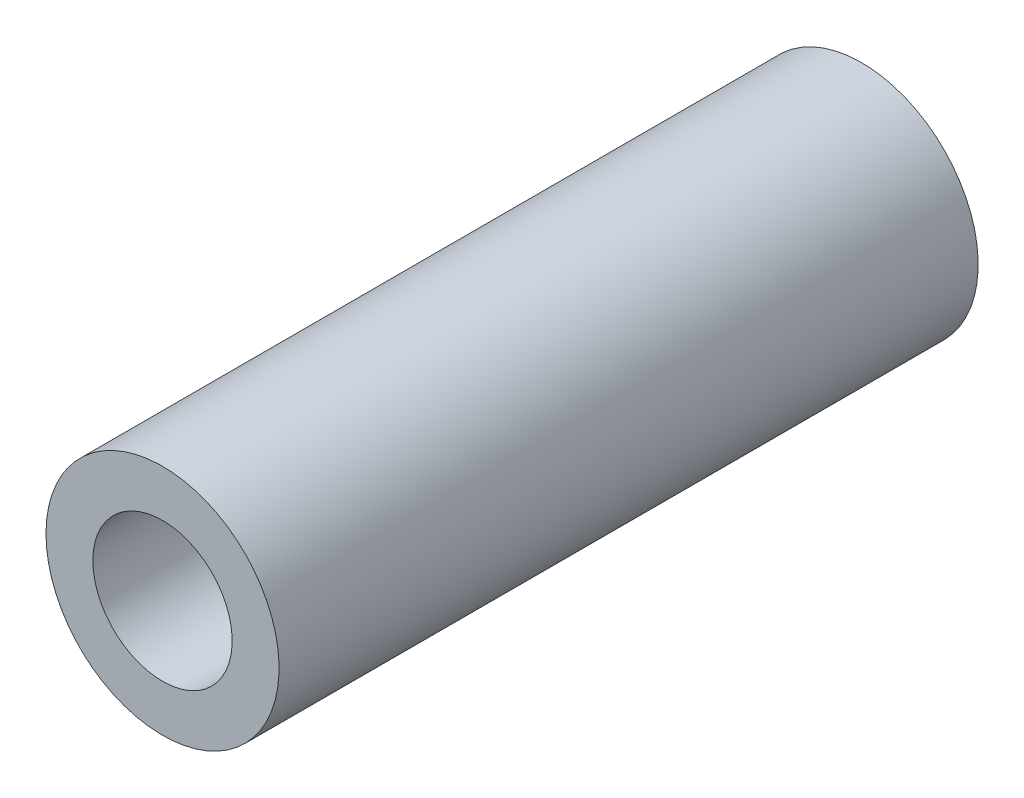
ISO-10303-21;
HEADER;
FILE_DESCRIPTION(('STEP AP214'),'2;1');
FILE_NAME('part.step','',(''),(''),'','','');
FILE_SCHEMA(('AUTOMOTIVE_DESIGN { 1 0 10303 214 1 1 1 1 }'));
ENDSEC;
DATA;
#1=APPLICATION_CONTEXT('core data for automotive mechanical design processes');
#2=APPLICATION_PROTOCOL_DEFINITION('international standard','automotive_design',2000,#1);
#3=PRODUCT_CONTEXT('',#1,'mechanical');
#4=PRODUCT('Part','Part','',(#3));
#5=PRODUCT_RELATED_PRODUCT_CATEGORY('part','',(#4));
#6=PRODUCT_DEFINITION_FORMATION('','',#4);
#7=PRODUCT_DEFINITION_CONTEXT('part definition',#1,'design');
#8=PRODUCT_DEFINITION('design','',#6,#7);
#9=PRODUCT_DEFINITION_SHAPE('','',#8);
#10=(LENGTH_UNIT() NAMED_UNIT(*) SI_UNIT(.MILLI.,.METRE.));
#11=(NAMED_UNIT(*) PLANE_ANGLE_UNIT() SI_UNIT($,.RADIAN.));
#12=(NAMED_UNIT(*) SI_UNIT($,.STERADIAN.) SOLID_ANGLE_UNIT());
#13=UNCERTAINTY_MEASURE_WITH_UNIT(LENGTH_MEASURE(1.E-05),#10,'distance_accuracy_value','');
#14=(GEOMETRIC_REPRESENTATION_CONTEXT(3) GLOBAL_UNCERTAINTY_ASSIGNED_CONTEXT((#13)) GLOBAL_UNIT_ASSIGNED_CONTEXT((#10,
#11,#12)) REPRESENTATION_CONTEXT('',''));
#15=CARTESIAN_POINT('',(0.,0.,0.));
#16=DIRECTION('',(0.,0.,1.));
#17=DIRECTION('',(1.,0.,0.));
#18=AXIS2_PLACEMENT_3D('',#15,#16,#17);
#19=CARTESIAN_POINT('',(0.,0.,19.05));
#20=DIRECTION('',(0.,0.,1.));
#21=DIRECTION('',(1.,0.,0.));
#22=AXIS2_PLACEMENT_3D('',#19,#20,#21);
#23=PLANE('',#22);
#24=CARTESIAN_POINT('',(0.,0.,19.05));
#25=DIRECTION('',(0.,0.,1.));
#26=DIRECTION('',(1.,0.,0.));
#27=AXIS2_PLACEMENT_3D('',#24,#25,#26);
#28=CIRCLE('',#27,3.175);
#29=CARTESIAN_POINT('',(-3.175,0.,19.05));
#30=VERTEX_POINT('',#29);
#31=EDGE_CURVE('E10',#30,#30,#28,.T.);
#32=ORIENTED_EDGE('',*,*,#31,.T.);
#33=EDGE_LOOP('',(#32));
#34=FACE_BOUND('',#33,.T.);
#35=CARTESIAN_POINT('',(0.,0.,19.05));
#36=DIRECTION('',(0.,0.,1.));
#37=DIRECTION('',(1.,0.,0.));
#38=AXIS2_PLACEMENT_3D('',#35,#36,#37);
#39=CIRCLE('',#38,1.89865);
#40=CARTESIAN_POINT('',(-1.89865,0.,19.05));
#41=VERTEX_POINT('',#40);
#42=EDGE_CURVE('E50',#41,#41,#39,.T.);
#43=ORIENTED_EDGE('',*,*,#42,.F.);
#44=EDGE_LOOP('',(#43));
#45=FACE_BOUND('',#44,.T.);
#46=ADVANCED_FACE('F37',(#34,#45),#23,.T.);
#47=CARTESIAN_POINT('',(0.,0.,0.));
#48=DIRECTION('',(0.,0.,1.));
#49=DIRECTION('',(1.,0.,0.));
#50=AXIS2_PLACEMENT_3D('',#47,#48,#49);
#51=PLANE('',#50);
#52=CARTESIAN_POINT('',(0.,0.,0.));
#53=DIRECTION('',(0.,0.,1.));
#54=DIRECTION('',(1.,0.,0.));
#55=AXIS2_PLACEMENT_3D('',#52,#53,#54);
#56=CIRCLE('',#55,3.175);
#57=CARTESIAN_POINT('',(-3.175,0.,0.));
#58=VERTEX_POINT('',#57);
#59=EDGE_CURVE('E41',#58,#58,#56,.T.);
#60=ORIENTED_EDGE('',*,*,#59,.F.);
#61=EDGE_LOOP('',(#60));
#62=FACE_BOUND('',#61,.T.);
#63=CARTESIAN_POINT('',(0.,0.,0.));
#64=DIRECTION('',(0.,0.,1.));
#65=DIRECTION('',(1.,0.,0.));
#66=AXIS2_PLACEMENT_3D('',#63,#64,#65);
#67=CIRCLE('',#66,1.89865);
#68=CARTESIAN_POINT('',(-1.89865,0.,0.));
#69=VERTEX_POINT('',#68);
#70=EDGE_CURVE('E52',#69,#69,#67,.T.);
#71=ORIENTED_EDGE('',*,*,#70,.T.);
#72=EDGE_LOOP('',(#71));
#73=FACE_BOUND('',#72,.T.);
#74=ADVANCED_FACE('F64',(#62,#73),#51,.F.);
#75=CARTESIAN_POINT('',(0.,0.,19.05));
#76=DIRECTION('',(0.,0.,-1.));
#77=DIRECTION('',(-1.,0.,0.));
#78=AXIS2_PLACEMENT_3D('',#75,#76,#77);
#79=CYLINDRICAL_SURFACE('',#78,3.175);
#80=CARTESIAN_POINT('',(-3.175,0.,19.05));
#81=CARTESIAN_POINT('',(-3.175,0.,18.8515625));
#82=CARTESIAN_POINT('',(-3.175,0.,18.653125));
#83=CARTESIAN_POINT('',(-3.175,0.,18.25625));
#84=CARTESIAN_POINT('',(-3.175,0.,18.0578125));
#85=CARTESIAN_POINT('',(-3.175,0.,17.6609375));
#86=CARTESIAN_POINT('',(-3.175,0.,17.4625));
#87=CARTESIAN_POINT('',(-3.175,0.,17.065625));
#88=CARTESIAN_POINT('',(-3.175,0.,16.8671875));
#89=CARTESIAN_POINT('',(-3.175,0.,16.4703125));
#90=CARTESIAN_POINT('',(-3.175,0.,16.271875));
#91=CARTESIAN_POINT('',(-3.175,0.,15.875));
#92=CARTESIAN_POINT('',(-3.175,0.,15.6765625));
#93=CARTESIAN_POINT('',(-3.175,0.,15.2796875));
#94=CARTESIAN_POINT('',(-3.175,0.,15.08125));
#95=CARTESIAN_POINT('',(-3.175,0.,14.684375));
#96=CARTESIAN_POINT('',(-3.175,0.,14.4859375));
#97=CARTESIAN_POINT('',(-3.175,0.,14.0890625));
#98=CARTESIAN_POINT('',(-3.175,0.,13.890625));
#99=CARTESIAN_POINT('',(-3.175,0.,13.49375));
#100=CARTESIAN_POINT('',(-3.175,0.,13.2953125));
#101=CARTESIAN_POINT('',(-3.175,0.,12.8984375));
#102=CARTESIAN_POINT('',(-3.175,0.,12.7));
#103=CARTESIAN_POINT('',(-3.175,0.,12.303125));
#104=CARTESIAN_POINT('',(-3.175,0.,12.1046875));
#105=CARTESIAN_POINT('',(-3.175,0.,11.7078125));
#106=CARTESIAN_POINT('',(-3.175,0.,11.509375));
#107=CARTESIAN_POINT('',(-3.175,0.,11.1125));
#108=CARTESIAN_POINT('',(-3.175,0.,10.9140625));
#109=CARTESIAN_POINT('',(-3.175,0.,10.5171875));
#110=CARTESIAN_POINT('',(-3.175,0.,10.31875));
#111=CARTESIAN_POINT('',(-3.175,0.,9.921875));
#112=CARTESIAN_POINT('',(-3.175,0.,9.7234375));
#113=CARTESIAN_POINT('',(-3.175,0.,9.3265625));
#114=CARTESIAN_POINT('',(-3.175,0.,9.128125));
#115=CARTESIAN_POINT('',(-3.175,0.,8.73125));
#116=CARTESIAN_POINT('',(-3.175,0.,8.5328125));
#117=CARTESIAN_POINT('',(-3.175,0.,8.1359375));
#118=CARTESIAN_POINT('',(-3.175,0.,7.9375));
#119=CARTESIAN_POINT('',(-3.175,0.,7.540625));
#120=CARTESIAN_POINT('',(-3.175,0.,7.3421875));
#121=CARTESIAN_POINT('',(-3.175,0.,6.9453125));
#122=CARTESIAN_POINT('',(-3.175,0.,6.746875));
#123=CARTESIAN_POINT('',(-3.175,0.,6.35));
#124=CARTESIAN_POINT('',(-3.175,0.,6.1515625));
#125=CARTESIAN_POINT('',(-3.175,0.,5.7546875));
#126=CARTESIAN_POINT('',(-3.175,0.,5.55625));
#127=CARTESIAN_POINT('',(-3.175,0.,5.159375));
#128=CARTESIAN_POINT('',(-3.175,0.,4.9609375));
#129=CARTESIAN_POINT('',(-3.175,0.,4.5640625));
#130=CARTESIAN_POINT('',(-3.175,0.,4.365625));
#131=CARTESIAN_POINT('',(-3.175,0.,3.96875));
#132=CARTESIAN_POINT('',(-3.175,0.,3.7703125));
#133=CARTESIAN_POINT('',(-3.175,0.,3.3734375));
#134=CARTESIAN_POINT('',(-3.175,0.,3.175));
#135=CARTESIAN_POINT('',(-3.175,0.,2.778125));
#136=CARTESIAN_POINT('',(-3.175,0.,2.5796875));
#137=CARTESIAN_POINT('',(-3.175,0.,2.1828125));
#138=CARTESIAN_POINT('',(-3.175,0.,1.984375));
#139=CARTESIAN_POINT('',(-3.175,0.,1.5875));
#140=CARTESIAN_POINT('',(-3.175,0.,1.3890625));
#141=CARTESIAN_POINT('',(-3.175,0.,0.992187500000001));
#142=CARTESIAN_POINT('',(-3.175,0.,0.793750000000001));
#143=CARTESIAN_POINT('',(-3.175,0.,0.396875));
#144=CARTESIAN_POINT('',(-3.175,0.,0.1984375));
#145=CARTESIAN_POINT('',(-3.175,0.,0.));
#146=B_SPLINE_CURVE_WITH_KNOTS('',3,(#80,#81,#82,#83,#84,#85,#86,#87,#88,#89,#90,#91,#92,#93,
#94,#95,#96,#97,#98,#99,#100,#101,#102,#103,#104,#105,#106,#107,#108,#109,#110,#111,#112,#113,
#114,#115,#116,#117,#118,#119,#120,#121,#122,#123,#124,#125,#126,#127,#128,#129,#130,#131,#132,
#133,#134,#135,#136,#137,#138,#139,#140,#141,#142,#143,#144,#145),.UNSPECIFIED.,.F.,.F.,(4,2,2,
2,2,2,2,2,2,2,2,2,2,2,2,2,2,2,2,2,2,2,2,2,2,2,2,2,2,2,2,2,4),(0.,0.595312499999997,1.190625,
1.7859375,2.38125,2.9765625,3.571875,4.1671875,4.7625,5.3578125,5.953125,6.5484375,7.14375,
7.7390625,8.334375,8.9296875,9.525,10.1203125,10.715625,11.3109375,11.90625,12.5015625,
13.096875,13.6921875,14.2875,14.8828125,15.478125,16.0734375,16.66875,17.2640625,17.859375,
18.4546875,19.05),.UNSPECIFIED.);
#147=EDGE_CURVE('BSEAM39',#30,#58,#146,.T.);
#148=ORIENTED_EDGE('',*,*,#31,.F.);
#149=ORIENTED_EDGE('',*,*,#59,.T.);
#150=ORIENTED_EDGE('',*,*,#147,.T.);
#151=ORIENTED_EDGE('',*,*,#147,.F.);
#152=EDGE_LOOP('',(#148,#150,#149,#151));
#153=FACE_BOUND('',#152,.T.);
#154=ADVANCED_FACE('F39',(#153),#79,.T.);
#155=CARTESIAN_POINT('',(0.,0.,19.05));
#156=DIRECTION('',(0.,0.,-1.));
#157=DIRECTION('',(-1.,0.,0.));
#158=AXIS2_PLACEMENT_3D('',#155,#156,#157);
#159=CYLINDRICAL_SURFACE('',#158,1.89865);
#160=CARTESIAN_POINT('',(-1.89865,0.,19.05));
#161=CARTESIAN_POINT('',(-1.89865,0.,18.8515625));
#162=CARTESIAN_POINT('',(-1.89865,0.,18.653125));
#163=CARTESIAN_POINT('',(-1.89865,0.,18.25625));
#164=CARTESIAN_POINT('',(-1.89865,0.,18.0578125));
#165=CARTESIAN_POINT('',(-1.89865,0.,17.6609375));
#166=CARTESIAN_POINT('',(-1.89865,0.,17.4625));
#167=CARTESIAN_POINT('',(-1.89865,0.,17.065625));
#168=CARTESIAN_POINT('',(-1.89865,0.,16.8671875));
#169=CARTESIAN_POINT('',(-1.89865,0.,16.4703125));
#170=CARTESIAN_POINT('',(-1.89865,0.,16.271875));
#171=CARTESIAN_POINT('',(-1.89865,0.,15.875));
#172=CARTESIAN_POINT('',(-1.89865,0.,15.6765625));
#173=CARTESIAN_POINT('',(-1.89865,0.,15.2796875));
#174=CARTESIAN_POINT('',(-1.89865,0.,15.08125));
#175=CARTESIAN_POINT('',(-1.89865,0.,14.684375));
#176=CARTESIAN_POINT('',(-1.89865,0.,14.4859375));
#177=CARTESIAN_POINT('',(-1.89865,0.,14.0890625));
#178=CARTESIAN_POINT('',(-1.89865,0.,13.890625));
#179=CARTESIAN_POINT('',(-1.89865,0.,13.49375));
#180=CARTESIAN_POINT('',(-1.89865,0.,13.2953125));
#181=CARTESIAN_POINT('',(-1.89865,0.,12.8984375));
#182=CARTESIAN_POINT('',(-1.89865,0.,12.7));
#183=CARTESIAN_POINT('',(-1.89865,0.,12.303125));
#184=CARTESIAN_POINT('',(-1.89865,0.,12.1046875));
#185=CARTESIAN_POINT('',(-1.89865,0.,11.7078125));
#186=CARTESIAN_POINT('',(-1.89865,0.,11.509375));
#187=CARTESIAN_POINT('',(-1.89865,0.,11.1125));
#188=CARTESIAN_POINT('',(-1.89865,0.,10.9140625));
#189=CARTESIAN_POINT('',(-1.89865,0.,10.5171875));
#190=CARTESIAN_POINT('',(-1.89865,0.,10.31875));
#191=CARTESIAN_POINT('',(-1.89865,0.,9.921875));
#192=CARTESIAN_POINT('',(-1.89865,0.,9.7234375));
#193=CARTESIAN_POINT('',(-1.89865,0.,9.3265625));
#194=CARTESIAN_POINT('',(-1.89865,0.,9.128125));
#195=CARTESIAN_POINT('',(-1.89865,0.,8.73125));
#196=CARTESIAN_POINT('',(-1.89865,0.,8.5328125));
#197=CARTESIAN_POINT('',(-1.89865,0.,8.1359375));
#198=CARTESIAN_POINT('',(-1.89865,0.,7.9375));
#199=CARTESIAN_POINT('',(-1.89865,0.,7.540625));
#200=CARTESIAN_POINT('',(-1.89865,0.,7.3421875));
#201=CARTESIAN_POINT('',(-1.89865,0.,6.9453125));
#202=CARTESIAN_POINT('',(-1.89865,0.,6.746875));
#203=CARTESIAN_POINT('',(-1.89865,0.,6.35));
#204=CARTESIAN_POINT('',(-1.89865,0.,6.1515625));
#205=CARTESIAN_POINT('',(-1.89865,0.,5.7546875));
#206=CARTESIAN_POINT('',(-1.89865,0.,5.55625));
#207=CARTESIAN_POINT('',(-1.89865,0.,5.159375));
#208=CARTESIAN_POINT('',(-1.89865,0.,4.9609375));
#209=CARTESIAN_POINT('',(-1.89865,0.,4.5640625));
#210=CARTESIAN_POINT('',(-1.89865,0.,4.365625));
#211=CARTESIAN_POINT('',(-1.89865,0.,3.96875));
#212=CARTESIAN_POINT('',(-1.89865,0.,3.7703125));
#213=CARTESIAN_POINT('',(-1.89865,0.,3.3734375));
#214=CARTESIAN_POINT('',(-1.89865,0.,3.175));
#215=CARTESIAN_POINT('',(-1.89865,0.,2.778125));
#216=CARTESIAN_POINT('',(-1.89865,0.,2.5796875));
#217=CARTESIAN_POINT('',(-1.89865,0.,2.1828125));
#218=CARTESIAN_POINT('',(-1.89865,0.,1.984375));
#219=CARTESIAN_POINT('',(-1.89865,0.,1.5875));
#220=CARTESIAN_POINT('',(-1.89865,0.,1.3890625));
#221=CARTESIAN_POINT('',(-1.89865,0.,0.992187500000001));
#222=CARTESIAN_POINT('',(-1.89865,0.,0.793750000000001));
#223=CARTESIAN_POINT('',(-1.89865,0.,0.396875));
#224=CARTESIAN_POINT('',(-1.89865,0.,0.1984375));
#225=CARTESIAN_POINT('',(-1.89865,0.,0.));
#226=B_SPLINE_CURVE_WITH_KNOTS('',3,(#160,#161,#162,#163,#164,#165,#166,#167,#168,#169,#170,
#171,#172,#173,#174,#175,#176,#177,#178,#179,#180,#181,#182,#183,#184,#185,#186,#187,#188,#189,
#190,#191,#192,#193,#194,#195,#196,#197,#198,#199,#200,#201,#202,#203,#204,#205,#206,#207,#208,
#209,#210,#211,#212,#213,#214,#215,#216,#217,#218,#219,#220,#221,#222,#223,#224,#225),
.UNSPECIFIED.,.F.,.F.,(4,2,2,2,2,2,2,2,2,2,2,2,2,2,2,2,2,2,2,2,2,2,2,2,2,2,2,2,2,2,2,2,4),(0.,
0.5953125,1.190625,1.7859375,2.38125,2.9765625,3.571875,4.1671875,4.7625,5.3578125,5.953125,
6.5484375,7.14375,7.7390625,8.334375,8.9296875,9.525,10.1203125,10.715625,11.3109375,11.90625,
12.5015625,13.096875,13.6921875,14.2875,14.8828125,15.478125,16.0734375,16.66875,17.2640625,
17.859375,18.4546875,19.05),.UNSPECIFIED.);
#227=EDGE_CURVE('BSEAM60',#41,#69,#226,.T.);
#228=ORIENTED_EDGE('',*,*,#42,.T.);
#229=ORIENTED_EDGE('',*,*,#70,.F.);
#230=ORIENTED_EDGE('',*,*,#227,.T.);
#231=ORIENTED_EDGE('',*,*,#227,.F.);
#232=EDGE_LOOP('',(#228,#230,#229,#231));
#233=FACE_BOUND('',#232,.T.);
#234=ADVANCED_FACE('F60',(#233),#159,.F.);
#235=CLOSED_SHELL('',(#46,#74,#154,#234));
#236=MANIFOLD_SOLID_BREP('B2',#235);
#237=ADVANCED_BREP_SHAPE_REPRESENTATION('',(#18,#236),#14);
#238=SHAPE_DEFINITION_REPRESENTATION(#9,#237);
ENDSEC;
END-ISO-10303-21;
